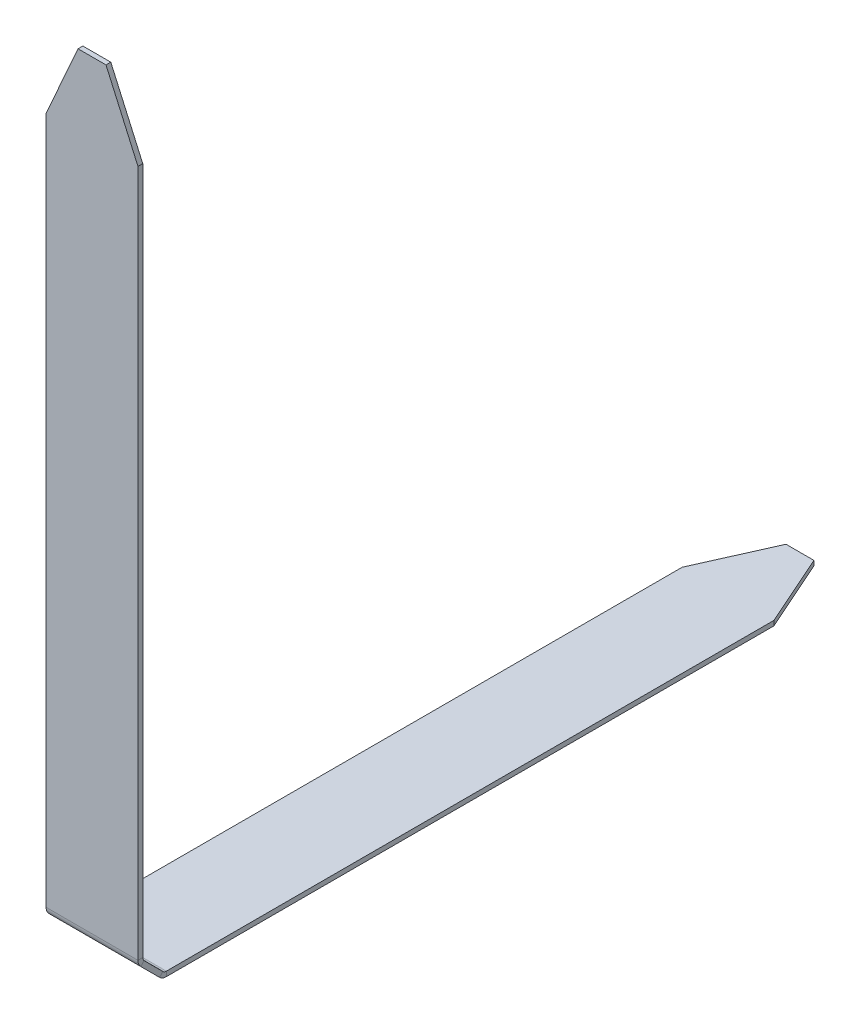
ISO-10303-21;
HEADER;
FILE_DESCRIPTION(('STEP AP214'),'2;1');
FILE_NAME('part.step','',(''),(''),'','','');
FILE_SCHEMA(('AUTOMOTIVE_DESIGN { 1 0 10303 214 1 1 1 1 }'));
ENDSEC;
DATA;
#1=APPLICATION_CONTEXT('core data for automotive mechanical design processes');
#2=APPLICATION_PROTOCOL_DEFINITION('international standard','automotive_design',2000,#1);
#3=PRODUCT_CONTEXT('',#1,'mechanical');
#4=PRODUCT('Part','Part','',(#3));
#5=PRODUCT_RELATED_PRODUCT_CATEGORY('part','',(#4));
#6=PRODUCT_DEFINITION_FORMATION('','',#4);
#7=PRODUCT_DEFINITION_CONTEXT('part definition',#1,'design');
#8=PRODUCT_DEFINITION('design','',#6,#7);
#9=PRODUCT_DEFINITION_SHAPE('','',#8);
#10=(LENGTH_UNIT() NAMED_UNIT(*) SI_UNIT(.MILLI.,.METRE.));
#11=(NAMED_UNIT(*) PLANE_ANGLE_UNIT() SI_UNIT($,.RADIAN.));
#12=(NAMED_UNIT(*) SI_UNIT($,.STERADIAN.) SOLID_ANGLE_UNIT());
#13=UNCERTAINTY_MEASURE_WITH_UNIT(LENGTH_MEASURE(1.E-05),#10,'distance_accuracy_value','');
#14=(GEOMETRIC_REPRESENTATION_CONTEXT(3) GLOBAL_UNCERTAINTY_ASSIGNED_CONTEXT((#13)) GLOBAL_UNIT_ASSIGNED_CONTEXT((#10,
#11,#12)) REPRESENTATION_CONTEXT('',''));
#15=CARTESIAN_POINT('',(0.,0.,0.));
#16=DIRECTION('',(0.,0.,1.));
#17=DIRECTION('',(1.,0.,0.));
#18=AXIS2_PLACEMENT_3D('',#15,#16,#17);
#19=CARTESIAN_POINT('',(115.,25.2426406871193,-1.75735931288074));
#20=DIRECTION('',(1.,0.,0.));
#21=DIRECTION('',(0.,0.,-1.));
#22=AXIS2_PLACEMENT_3D('',#19,#20,#21);
#23=PLANE('',#22);
#24=DIRECTION('',(0.,-0.707106781186548,0.707106781186548));
#25=VECTOR('',#24,1.);
#26=CARTESIAN_POINT('',(115.,25.2426406871193,-1.75735931288074));
#27=LINE('',#26,#25);
#28=CARTESIAN_POINT('',(115.,25.2426406871193,-1.75735931288074));
#29=VERTEX_POINT('',#28);
#30=CARTESIAN_POINT('',(115.,21.,2.48528137423854));
#31=VERTEX_POINT('',#30);
#32=EDGE_CURVE('E274',#29,#31,#27,.T.);
#33=ORIENTED_EDGE('',*,*,#32,.F.);
#34=CARTESIAN_POINT('',(115.,29.4852813742385,-6.00000000000003));
#35=DIRECTION('',(-1.,0.,0.));
#36=DIRECTION('',(0.,0.,1.));
#37=AXIS2_PLACEMENT_3D('',#34,#35,#36);
#38=CIRCLE('',#37,6.);
#39=CARTESIAN_POINT('',(115.,29.4852813742386,0.));
#40=VERTEX_POINT('',#39);
#41=EDGE_CURVE('E193',#40,#29,#38,.F.);
#42=ORIENTED_EDGE('',*,*,#41,.F.);
#43=DIRECTION('',(0.,0.,-1.));
#44=VECTOR('',#43,1.);
#45=CARTESIAN_POINT('',(115.,29.4852813742386,5.99999999999997));
#46=LINE('',#45,#44);
#47=CARTESIAN_POINT('',(115.,29.4852813742386,5.99999999999997));
#48=VERTEX_POINT('',#47);
#49=EDGE_CURVE('E271',#48,#40,#46,.T.);
#50=ORIENTED_EDGE('',*,*,#49,.F.);
#51=CARTESIAN_POINT('',(115.,29.4852813742385,-6.00000000000003));
#52=DIRECTION('',(1.,0.,0.));
#53=DIRECTION('',(0.,0.,-1.));
#54=AXIS2_PLACEMENT_3D('',#51,#52,#53);
#55=CIRCLE('',#54,12.);
#56=EDGE_CURVE('E203',#48,#31,#55,.T.);
#57=ORIENTED_EDGE('',*,*,#56,.T.);
#58=EDGE_LOOP('',(#33,#42,#50,#57));
#59=FACE_BOUND('',#58,.T.);
#60=ADVANCED_FACE('F38',(#59),#23,.T.);
#61=CARTESIAN_POINT('',(115.,29.4852813742386,5.99999999999997));
#62=DIRECTION('',(1.,0.,0.));
#63=DIRECTION('',(0.,0.,-1.));
#64=AXIS2_PLACEMENT_3D('',#61,#62,#63);
#65=PLANE('',#64);
#66=DIRECTION('',(0.,-0.707106781186548,-0.707106781186548));
#67=VECTOR('',#66,1.);
#68=CARTESIAN_POINT('',(115.,27.,0.));
#69=LINE('',#68,#67);
#70=CARTESIAN_POINT('',(115.,1.7573593128807,-25.2426406871193));
#71=VERTEX_POINT('',#70);
#72=EDGE_CURVE('E191',#29,#71,#69,.T.);
#73=ORIENTED_EDGE('',*,*,#72,.F.);
#74=ORIENTED_EDGE('',*,*,#32,.T.);
#75=DIRECTION('',(0.,-0.707106781186548,-0.707106781186548));
#76=VECTOR('',#75,1.);
#77=CARTESIAN_POINT('',(115.,22.7573593128807,4.24264068711929));
#78=LINE('',#77,#76);
#79=CARTESIAN_POINT('',(115.,-2.48528137423859,-21.));
#80=VERTEX_POINT('',#79);
#81=EDGE_CURVE('E206',#31,#80,#78,.T.);
#82=ORIENTED_EDGE('',*,*,#81,.T.);
#83=DIRECTION('',(0.,0.707106781186549,-0.707106781186546));
#84=VECTOR('',#83,1.);
#85=CARTESIAN_POINT('',(115.,-2.48528137423859,-21.));
#86=LINE('',#85,#84);
#87=EDGE_CURVE('E164',#80,#71,#86,.T.);
#88=ORIENTED_EDGE('',*,*,#87,.T.);
#89=EDGE_LOOP('',(#73,#74,#82,#88));
#90=FACE_BOUND('',#89,.T.);
#91=ADVANCED_FACE('F341',(#90),#65,.T.);
#92=CARTESIAN_POINT('',(0.,29.4852813742386,0.));
#93=DIRECTION('',(-1.,0.,0.));
#94=DIRECTION('',(0.,0.,1.));
#95=AXIS2_PLACEMENT_3D('',#92,#93,#94);
#96=PLANE('',#95);
#97=DIRECTION('',(0.,0.,1.));
#98=VECTOR('',#97,1.);
#99=CARTESIAN_POINT('',(0.,29.4852813742386,0.));
#100=LINE('',#99,#98);
#101=CARTESIAN_POINT('',(0.,29.4852813742386,0.));
#102=VERTEX_POINT('',#101);
#103=CARTESIAN_POINT('',(0.,29.4852813742386,5.99999999999997));
#104=VERTEX_POINT('',#103);
#105=EDGE_CURVE('E268',#102,#104,#100,.T.);
#106=ORIENTED_EDGE('',*,*,#105,.F.);
#107=CARTESIAN_POINT('',(0.,29.4852813742385,-6.00000000000003));
#108=DIRECTION('',(-1.,0.,0.));
#109=DIRECTION('',(0.,0.,1.));
#110=AXIS2_PLACEMENT_3D('',#107,#108,#109);
#111=CIRCLE('',#110,6.);
#112=CARTESIAN_POINT('',(0.,25.2426406871193,-1.75735931288074));
#113=VERTEX_POINT('',#112);
#114=EDGE_CURVE('E220',#102,#113,#111,.F.);
#115=ORIENTED_EDGE('',*,*,#114,.T.);
#116=DIRECTION('',(0.,0.707106781186548,-0.707106781186548));
#117=VECTOR('',#116,1.);
#118=CARTESIAN_POINT('',(0.,21.,2.48528137423854));
#119=LINE('',#118,#117);
#120=CARTESIAN_POINT('',(0.,21.,2.48528137423854));
#121=VERTEX_POINT('',#120);
#122=EDGE_CURVE('E163',#121,#113,#119,.T.);
#123=ORIENTED_EDGE('',*,*,#122,.F.);
#124=CARTESIAN_POINT('',(0.,29.4852813742385,-6.00000000000003));
#125=DIRECTION('',(1.,0.,0.));
#126=DIRECTION('',(0.,0.,-1.));
#127=AXIS2_PLACEMENT_3D('',#124,#125,#126);
#128=CIRCLE('',#127,12.);
#129=EDGE_CURVE('E227',#104,#121,#128,.T.);
#130=ORIENTED_EDGE('',*,*,#129,.F.);
#131=EDGE_LOOP('',(#106,#115,#123,#130));
#132=FACE_BOUND('',#131,.T.);
#133=ADVANCED_FACE('F322',(#132),#96,.T.);
#134=CARTESIAN_POINT('',(0.,21.,2.48528137423854));
#135=DIRECTION('',(-1.,0.,0.));
#136=DIRECTION('',(0.,0.,1.));
#137=AXIS2_PLACEMENT_3D('',#134,#135,#136);
#138=PLANE('',#137);
#139=DIRECTION('',(0.,-1.,0.));
#140=VECTOR('',#139,1.);
#141=CARTESIAN_POINT('',(0.,980.,6.00000000000001));
#142=LINE('',#141,#140);
#143=CARTESIAN_POINT('',(0.,889.999999999999,6.00000000000001));
#144=VERTEX_POINT('',#143);
#145=EDGE_CURVE('E225',#144,#104,#142,.T.);
#146=ORIENTED_EDGE('',*,*,#145,.F.);
#147=DIRECTION('',(0.,0.,-1.));
#148=VECTOR('',#147,1.);
#149=CARTESIAN_POINT('',(0.,889.999999999999,2.48528137423854));
#150=LINE('',#149,#148);
#151=CARTESIAN_POINT('',(0.,889.999999999999,0.));
#152=VERTEX_POINT('',#151);
#153=EDGE_CURVE('E302',#144,#152,#150,.T.);
#154=ORIENTED_EDGE('',*,*,#153,.T.);
#155=DIRECTION('',(0.,-1.,0.));
#156=VECTOR('',#155,1.);
#157=CARTESIAN_POINT('',(0.,980.,0.));
#158=LINE('',#157,#156);
#159=EDGE_CURVE('E223',#152,#102,#158,.T.);
#160=ORIENTED_EDGE('',*,*,#159,.T.);
#161=ORIENTED_EDGE('',*,*,#105,.T.);
#162=EDGE_LOOP('',(#146,#154,#160,#161));
#163=FACE_BOUND('',#162,.T.);
#164=ADVANCED_FACE('F308',(#163),#138,.T.);
#165=CARTESIAN_POINT('',(115.,0.,-29.4852813742386));
#166=DIRECTION('',(1.,0.,0.));
#167=DIRECTION('',(0.,0.,-1.));
#168=AXIS2_PLACEMENT_3D('',#165,#166,#167);
#169=PLANE('',#168);
#170=DIRECTION('',(0.,-1.,0.));
#171=VECTOR('',#170,1.);
#172=CARTESIAN_POINT('',(115.,0.,-29.4852813742386));
#173=LINE('',#172,#171);
#174=CARTESIAN_POINT('',(115.,0.,-29.4852813742386));
#175=VERTEX_POINT('',#174);
#176=CARTESIAN_POINT('',(115.,-6.,-29.4852813742386));
#177=VERTEX_POINT('',#176);
#178=EDGE_CURVE('E151',#175,#177,#173,.T.);
#179=ORIENTED_EDGE('',*,*,#178,.F.);
#180=CARTESIAN_POINT('',(115.,6.,-29.4852813742386));
#181=DIRECTION('',(-1.,0.,0.));
#182=DIRECTION('',(0.,0.,1.));
#183=AXIS2_PLACEMENT_3D('',#180,#181,#182);
#184=CIRCLE('',#183,6.);
#185=EDGE_CURVE('E155',#71,#175,#184,.F.);
#186=ORIENTED_EDGE('',*,*,#185,.F.);
#187=ORIENTED_EDGE('',*,*,#87,.F.);
#188=CARTESIAN_POINT('',(115.,6.,-29.4852813742386));
#189=DIRECTION('',(1.,0.,0.));
#190=DIRECTION('',(0.,0.,-1.));
#191=AXIS2_PLACEMENT_3D('',#188,#189,#190);
#192=CIRCLE('',#191,12.);
#193=EDGE_CURVE('E158',#80,#177,#192,.T.);
#194=ORIENTED_EDGE('',*,*,#193,.T.);
#195=EDGE_LOOP('',(#179,#186,#187,#194));
#196=FACE_BOUND('',#195,.T.);
#197=ADVANCED_FACE('F153',(#196),#169,.T.);
#198=CARTESIAN_POINT('',(115.,-2.48528137423859,-21.));
#199=DIRECTION('',(1.,0.,0.));
#200=DIRECTION('',(0.,0.,-1.));
#201=AXIS2_PLACEMENT_3D('',#198,#199,#200);
#202=PLANE('',#201);
#203=DIRECTION('',(0.,0.,-1.));
#204=VECTOR('',#203,1.);
#205=CARTESIAN_POINT('',(115.,-6.,-27.));
#206=LINE('',#205,#204);
#207=CARTESIAN_POINT('',(115.,-6.,-789.999999999999));
#208=VERTEX_POINT('',#207);
#209=EDGE_CURVE('E186',#177,#208,#206,.T.);
#210=ORIENTED_EDGE('',*,*,#209,.T.);
#211=DIRECTION('',(0.,1.,0.));
#212=VECTOR('',#211,1.);
#213=CARTESIAN_POINT('',(115.,-2.48528137423859,-789.999999999999));
#214=LINE('',#213,#212);
#215=CARTESIAN_POINT('',(115.,0.,-789.999999999999));
#216=VERTEX_POINT('',#215);
#217=EDGE_CURVE('E185',#208,#216,#214,.T.);
#218=ORIENTED_EDGE('',*,*,#217,.T.);
#219=DIRECTION('',(0.,0.,-1.));
#220=VECTOR('',#219,1.);
#221=CARTESIAN_POINT('',(115.,0.,-27.));
#222=LINE('',#221,#220);
#223=EDGE_CURVE('E173',#175,#216,#222,.T.);
#224=ORIENTED_EDGE('',*,*,#223,.F.);
#225=ORIENTED_EDGE('',*,*,#178,.T.);
#226=EDGE_LOOP('',(#210,#218,#224,#225));
#227=FACE_BOUND('',#226,.T.);
#228=ADVANCED_FACE('F183',(#227),#202,.T.);
#229=CARTESIAN_POINT('',(0.,1.7573593128807,-25.2426406871193));
#230=DIRECTION('',(-1.,0.,0.));
#231=DIRECTION('',(0.,0.,1.));
#232=AXIS2_PLACEMENT_3D('',#229,#230,#231);
#233=PLANE('',#232);
#234=DIRECTION('',(0.,-0.707106781186549,0.707106781186546));
#235=VECTOR('',#234,1.);
#236=CARTESIAN_POINT('',(0.,1.7573593128807,-25.2426406871193));
#237=LINE('',#236,#235);
#238=CARTESIAN_POINT('',(0.,1.7573593128807,-25.2426406871193));
#239=VERTEX_POINT('',#238);
#240=CARTESIAN_POINT('',(0.,-2.48528137423859,-21.));
#241=VERTEX_POINT('',#240);
#242=EDGE_CURVE('E264',#239,#241,#237,.T.);
#243=ORIENTED_EDGE('',*,*,#242,.F.);
#244=CARTESIAN_POINT('',(0.,6.,-29.4852813742386));
#245=DIRECTION('',(-1.,0.,0.));
#246=DIRECTION('',(0.,0.,1.));
#247=AXIS2_PLACEMENT_3D('',#244,#245,#246);
#248=CIRCLE('',#247,6.);
#249=CARTESIAN_POINT('',(0.,0.,-29.4852813742386));
#250=VERTEX_POINT('',#249);
#251=EDGE_CURVE('E215',#239,#250,#248,.F.);
#252=ORIENTED_EDGE('',*,*,#251,.T.);
#253=DIRECTION('',(0.,1.,0.));
#254=VECTOR('',#253,1.);
#255=CARTESIAN_POINT('',(0.,-6.,-29.4852813742386));
#256=LINE('',#255,#254);
#257=CARTESIAN_POINT('',(0.,-6.,-29.4852813742386));
#258=VERTEX_POINT('',#257);
#259=EDGE_CURVE('E262',#258,#250,#256,.T.);
#260=ORIENTED_EDGE('',*,*,#259,.F.);
#261=CARTESIAN_POINT('',(0.,6.,-29.4852813742386));
#262=DIRECTION('',(1.,0.,0.));
#263=DIRECTION('',(0.,0.,-1.));
#264=AXIS2_PLACEMENT_3D('',#261,#262,#263);
#265=CIRCLE('',#264,12.);
#266=EDGE_CURVE('E233',#241,#258,#265,.T.);
#267=ORIENTED_EDGE('',*,*,#266,.F.);
#268=EDGE_LOOP('',(#243,#252,#260,#267));
#269=FACE_BOUND('',#268,.T.);
#270=ADVANCED_FACE('F391',(#269),#233,.T.);
#271=CARTESIAN_POINT('',(0.,-6.,-29.4852813742386));
#272=DIRECTION('',(-1.,0.,0.));
#273=DIRECTION('',(0.,0.,1.));
#274=AXIS2_PLACEMENT_3D('',#271,#272,#273);
#275=PLANE('',#274);
#276=DIRECTION('',(0.,-0.707106781186548,-0.707106781186548));
#277=VECTOR('',#276,1.);
#278=CARTESIAN_POINT('',(0.,27.,0.));
#279=LINE('',#278,#277);
#280=EDGE_CURVE('E217',#113,#239,#279,.T.);
#281=ORIENTED_EDGE('',*,*,#280,.T.);
#282=ORIENTED_EDGE('',*,*,#242,.T.);
#283=DIRECTION('',(0.,-0.707106781186548,-0.707106781186548));
#284=VECTOR('',#283,1.);
#285=CARTESIAN_POINT('',(0.,22.7573593128807,4.24264068711929));
#286=LINE('',#285,#284);
#287=EDGE_CURVE('E230',#121,#241,#286,.T.);
#288=ORIENTED_EDGE('',*,*,#287,.F.);
#289=ORIENTED_EDGE('',*,*,#122,.T.);
#290=EDGE_LOOP('',(#281,#282,#288,#289));
#291=FACE_BOUND('',#290,.T.);
#292=ADVANCED_FACE('F393',(#291),#275,.T.);
#293=CARTESIAN_POINT('',(115.,-6.,-27.));
#294=DIRECTION('',(0.,1.,0.));
#295=DIRECTION('',(0.,0.,1.));
#296=AXIS2_PLACEMENT_3D('',#293,#294,#295);
#297=PLANE('',#296);
#298=DIRECTION('',(0.,0.,-1.));
#299=VECTOR('',#298,1.);
#300=CARTESIAN_POINT('',(0.,-6.,-27.));
#301=LINE('',#300,#299);
#302=CARTESIAN_POINT('',(0.,-6.,-789.999999999999));
#303=VERTEX_POINT('',#302);
#304=EDGE_CURVE('E211',#258,#303,#301,.T.);
#305=ORIENTED_EDGE('',*,*,#304,.T.);
#306=DIRECTION('',(-0.406138466053445,0.,0.913811548620258));
#307=VECTOR('',#306,1.);
#308=CARTESIAN_POINT('',(0.,-6.,-789.999999999999));
#309=LINE('',#308,#307);
#310=CARTESIAN_POINT('',(40.,-6.,-880.));
#311=VERTEX_POINT('',#310);
#312=EDGE_CURVE('E296',#303,#311,#309,.F.);
#313=ORIENTED_EDGE('',*,*,#312,.T.);
#314=DIRECTION('',(-1.,0.,0.));
#315=VECTOR('',#314,1.);
#316=CARTESIAN_POINT('',(115.,-6.,-880.));
#317=LINE('',#316,#315);
#318=CARTESIAN_POINT('',(74.9999999999999,-6.,-880.));
#319=VERTEX_POINT('',#318);
#320=EDGE_CURVE('E259',#319,#311,#317,.T.);
#321=ORIENTED_EDGE('',*,*,#320,.F.);
#322=DIRECTION('',(-0.406138466053446,0.,-0.913811548620258));
#323=VECTOR('',#322,1.);
#324=CARTESIAN_POINT('',(74.9999999999999,-6.,-880.));
#325=LINE('',#324,#323);
#326=EDGE_CURVE('E279',#319,#208,#325,.F.);
#327=ORIENTED_EDGE('',*,*,#326,.T.);
#328=ORIENTED_EDGE('',*,*,#209,.F.);
#329=DIRECTION('',(-1.,0.,0.));
#330=VECTOR('',#329,1.);
#331=CARTESIAN_POINT('',(115.,-6.,-29.4852813742386));
#332=LINE('',#331,#330);
#333=EDGE_CURVE('E210',#177,#258,#332,.T.);
#334=ORIENTED_EDGE('',*,*,#333,.T.);
#335=EDGE_LOOP('',(#305,#313,#321,#327,#328,#334));
#336=FACE_BOUND('',#335,.T.);
#337=ADVANCED_FACE('F380',(#336),#297,.F.);
#338=CARTESIAN_POINT('',(115.,0.,-880.));
#339=DIRECTION('',(0.,0.,-1.));
#340=DIRECTION('',(-1.,0.,0.));
#341=AXIS2_PLACEMENT_3D('',#338,#339,#340);
#342=PLANE('',#341);
#343=ORIENTED_EDGE('',*,*,#320,.T.);
#344=DIRECTION('',(0.,1.,0.));
#345=VECTOR('',#344,1.);
#346=CARTESIAN_POINT('',(40.,0.,-880.));
#347=LINE('',#346,#345);
#348=CARTESIAN_POINT('',(40.,0.,-880.));
#349=VERTEX_POINT('',#348);
#350=EDGE_CURVE('E298',#311,#349,#347,.T.);
#351=ORIENTED_EDGE('',*,*,#350,.T.);
#352=DIRECTION('',(-1.,0.,0.));
#353=VECTOR('',#352,1.);
#354=CARTESIAN_POINT('',(115.,0.,-880.));
#355=LINE('',#354,#353);
#356=CARTESIAN_POINT('',(74.9999999999999,0.,-880.));
#357=VERTEX_POINT('',#356);
#358=EDGE_CURVE('E180',#357,#349,#355,.T.);
#359=ORIENTED_EDGE('',*,*,#358,.F.);
#360=DIRECTION('',(0.,-1.,0.));
#361=VECTOR('',#360,1.);
#362=CARTESIAN_POINT('',(74.9999999999999,0.,-880.));
#363=LINE('',#362,#361);
#364=EDGE_CURVE('E276',#357,#319,#363,.T.);
#365=ORIENTED_EDGE('',*,*,#364,.T.);
#366=EDGE_LOOP('',(#343,#351,#359,#365));
#367=FACE_BOUND('',#366,.T.);
#368=ADVANCED_FACE('F386',(#367),#342,.T.);
#369=CARTESIAN_POINT('',(115.,0.,-27.));
#370=DIRECTION('',(0.,1.,0.));
#371=DIRECTION('',(0.,0.,1.));
#372=AXIS2_PLACEMENT_3D('',#369,#370,#371);
#373=PLANE('',#372);
#374=ORIENTED_EDGE('',*,*,#358,.T.);
#375=DIRECTION('',(0.406138466053445,0.,-0.913811548620258));
#376=VECTOR('',#375,1.);
#377=CARTESIAN_POINT('',(-264.206185567009,0.,-195.536082474225));
#378=LINE('',#377,#376);
#379=CARTESIAN_POINT('',(0.,0.,-789.999999999999));
#380=VERTEX_POINT('',#379);
#381=EDGE_CURVE('E300',#349,#380,#378,.F.);
#382=ORIENTED_EDGE('',*,*,#381,.T.);
#383=DIRECTION('',(0.,0.,-1.));
#384=VECTOR('',#383,1.);
#385=CARTESIAN_POINT('',(0.,0.,-27.));
#386=LINE('',#385,#384);
#387=EDGE_CURVE('E176',#250,#380,#386,.T.);
#388=ORIENTED_EDGE('',*,*,#387,.F.);
#389=DIRECTION('',(-1.,0.,0.));
#390=VECTOR('',#389,1.);
#391=CARTESIAN_POINT('',(115.,0.,-29.4852813742386));
#392=LINE('',#391,#390);
#393=EDGE_CURVE('E170',#175,#250,#392,.T.);
#394=ORIENTED_EDGE('',*,*,#393,.F.);
#395=ORIENTED_EDGE('',*,*,#223,.T.);
#396=DIRECTION('',(0.406138466053446,0.,0.913811548620258));
#397=VECTOR('',#396,1.);
#398=CARTESIAN_POINT('',(398.175257731958,0.,-152.855670103092));
#399=LINE('',#398,#397);
#400=EDGE_CURVE('E282',#216,#357,#399,.F.);
#401=ORIENTED_EDGE('',*,*,#400,.T.);
#402=EDGE_LOOP('',(#374,#382,#388,#394,#395,#401));
#403=FACE_BOUND('',#402,.T.);
#404=ADVANCED_FACE('F172',(#403),#373,.T.);
#405=CARTESIAN_POINT('',(115.,6.,-29.4852813742386));
#406=DIRECTION('',(-1.,0.,0.));
#407=DIRECTION('',(0.,0.,1.));
#408=AXIS2_PLACEMENT_3D('',#405,#406,#407);
#409=CYLINDRICAL_SURFACE('',#408,6.);
#410=ORIENTED_EDGE('',*,*,#251,.F.);
#411=DIRECTION('',(-1.,0.,0.));
#412=VECTOR('',#411,1.);
#413=CARTESIAN_POINT('',(115.,1.7573593128807,-25.2426406871193));
#414=LINE('',#413,#412);
#415=EDGE_CURVE('E181',#71,#239,#414,.T.);
#416=ORIENTED_EDGE('',*,*,#415,.F.);
#417=ORIENTED_EDGE('',*,*,#185,.T.);
#418=ORIENTED_EDGE('',*,*,#393,.T.);
#419=EDGE_LOOP('',(#410,#416,#417,#418));
#420=FACE_BOUND('',#419,.T.);
#421=ADVANCED_FACE('F189',(#420),#409,.F.);
#422=CARTESIAN_POINT('',(115.,27.,0.));
#423=DIRECTION('',(0.,0.707106781186547,-0.707106781186547));
#424=DIRECTION('',(0.,0.707106781186548,0.707106781186548));
#425=AXIS2_PLACEMENT_3D('',#422,#423,#424);
#426=PLANE('',#425);
#427=ORIENTED_EDGE('',*,*,#280,.F.);
#428=DIRECTION('',(-1.,0.,0.));
#429=VECTOR('',#428,1.);
#430=CARTESIAN_POINT('',(115.,25.2426406871193,-1.75735931288074));
#431=LINE('',#430,#429);
#432=EDGE_CURVE('E254',#29,#113,#431,.T.);
#433=ORIENTED_EDGE('',*,*,#432,.F.);
#434=ORIENTED_EDGE('',*,*,#72,.T.);
#435=ORIENTED_EDGE('',*,*,#415,.T.);
#436=EDGE_LOOP('',(#427,#433,#434,#435));
#437=FACE_BOUND('',#436,.T.);
#438=ADVANCED_FACE('F368',(#437),#426,.T.);
#439=CARTESIAN_POINT('',(115.,29.4852813742385,-6.00000000000003));
#440=DIRECTION('',(-1.,0.,0.));
#441=DIRECTION('',(0.,0.,1.));
#442=AXIS2_PLACEMENT_3D('',#439,#440,#441);
#443=CYLINDRICAL_SURFACE('',#442,6.);
#444=ORIENTED_EDGE('',*,*,#114,.F.);
#445=DIRECTION('',(-1.,0.,0.));
#446=VECTOR('',#445,1.);
#447=CARTESIAN_POINT('',(115.,29.4852813742386,0.));
#448=LINE('',#447,#446);
#449=EDGE_CURVE('E251',#40,#102,#448,.T.);
#450=ORIENTED_EDGE('',*,*,#449,.F.);
#451=ORIENTED_EDGE('',*,*,#41,.T.);
#452=ORIENTED_EDGE('',*,*,#432,.T.);
#453=EDGE_LOOP('',(#444,#450,#451,#452));
#454=FACE_BOUND('',#453,.T.);
#455=ADVANCED_FACE('F318',(#454),#443,.F.);
#456=CARTESIAN_POINT('',(115.,980.,0.));
#457=DIRECTION('',(0.,0.,-1.));
#458=DIRECTION('',(0.,1.,0.));
#459=AXIS2_PLACEMENT_3D('',#456,#457,#458);
#460=PLANE('',#459);
#461=ORIENTED_EDGE('',*,*,#159,.F.);
#462=DIRECTION('',(-0.406138466053445,-0.913811548620258,0.));
#463=VECTOR('',#462,1.);
#464=CARTESIAN_POINT('',(52.3711340206184,1007.83505154639,0.));
#465=LINE('',#464,#463);
#466=CARTESIAN_POINT('',(40.,980.,0.));
#467=VERTEX_POINT('',#466);
#468=EDGE_CURVE('E60',#152,#467,#465,.F.);
#469=ORIENTED_EDGE('',*,*,#468,.T.);
#470=DIRECTION('',(-1.,0.,0.));
#471=VECTOR('',#470,1.);
#472=CARTESIAN_POINT('',(115.,980.,0.));
#473=LINE('',#472,#471);
#474=CARTESIAN_POINT('',(74.9999999999999,980.,0.));
#475=VERTEX_POINT('',#474);
#476=EDGE_CURVE('E249',#475,#467,#473,.T.);
#477=ORIENTED_EDGE('',*,*,#476,.F.);
#478=DIRECTION('',(0.406138466053446,-0.913811548620258,0.));
#479=VECTOR('',#478,1.);
#480=CARTESIAN_POINT('',(81.5979381443297,965.154639175258,0.));
#481=LINE('',#480,#479);
#482=CARTESIAN_POINT('',(115.,889.999999999999,0.));
#483=VERTEX_POINT('',#482);
#484=EDGE_CURVE('E287',#475,#483,#481,.T.);
#485=ORIENTED_EDGE('',*,*,#484,.T.);
#486=DIRECTION('',(0.,-1.,0.));
#487=VECTOR('',#486,1.);
#488=CARTESIAN_POINT('',(115.,980.,0.));
#489=LINE('',#488,#487);
#490=EDGE_CURVE('E199',#483,#40,#489,.T.);
#491=ORIENTED_EDGE('',*,*,#490,.T.);
#492=ORIENTED_EDGE('',*,*,#449,.T.);
#493=EDGE_LOOP('',(#461,#469,#477,#485,#491,#492));
#494=FACE_BOUND('',#493,.T.);
#495=ADVANCED_FACE('F312',(#494),#460,.T.);
#496=CARTESIAN_POINT('',(115.,980.,6.00000000000001));
#497=DIRECTION('',(0.,1.,0.));
#498=DIRECTION('',(0.,0.,1.));
#499=AXIS2_PLACEMENT_3D('',#496,#497,#498);
#500=PLANE('',#499);
#501=ORIENTED_EDGE('',*,*,#476,.T.);
#502=DIRECTION('',(0.,0.,1.));
#503=VECTOR('',#502,1.);
#504=CARTESIAN_POINT('',(40.,980.,6.00000000000001));
#505=LINE('',#504,#503);
#506=CARTESIAN_POINT('',(40.,980.,6.00000000000001));
#507=VERTEX_POINT('',#506);
#508=EDGE_CURVE('E46',#467,#507,#505,.T.);
#509=ORIENTED_EDGE('',*,*,#508,.T.);
#510=DIRECTION('',(-1.,0.,0.));
#511=VECTOR('',#510,1.);
#512=CARTESIAN_POINT('',(115.,980.,6.00000000000001));
#513=LINE('',#512,#511);
#514=CARTESIAN_POINT('',(74.9999999999999,980.,6.00000000000001));
#515=VERTEX_POINT('',#514);
#516=EDGE_CURVE('E247',#515,#507,#513,.T.);
#517=ORIENTED_EDGE('',*,*,#516,.F.);
#518=DIRECTION('',(0.,0.,-1.));
#519=VECTOR('',#518,1.);
#520=CARTESIAN_POINT('',(74.9999999999999,980.,0.));
#521=LINE('',#520,#519);
#522=EDGE_CURVE('E284',#515,#475,#521,.T.);
#523=ORIENTED_EDGE('',*,*,#522,.T.);
#524=EDGE_LOOP('',(#501,#509,#517,#523));
#525=FACE_BOUND('',#524,.T.);
#526=ADVANCED_FACE('F362',(#525),#500,.T.);
#527=CARTESIAN_POINT('',(115.,980.,6.00000000000001));
#528=DIRECTION('',(0.,0.,-1.));
#529=DIRECTION('',(0.,1.,0.));
#530=AXIS2_PLACEMENT_3D('',#527,#528,#529);
#531=PLANE('',#530);
#532=ORIENTED_EDGE('',*,*,#516,.T.);
#533=DIRECTION('',(0.406138466053445,0.913811548620258,0.));
#534=VECTOR('',#533,1.);
#535=CARTESIAN_POINT('',(0.,889.999999999999,6.00000000000001));
#536=LINE('',#535,#534);
#537=EDGE_CURVE('E11',#507,#144,#536,.F.);
#538=ORIENTED_EDGE('',*,*,#537,.T.);
#539=ORIENTED_EDGE('',*,*,#145,.T.);
#540=DIRECTION('',(-1.,0.,0.));
#541=VECTOR('',#540,1.);
#542=CARTESIAN_POINT('',(115.,29.4852813742386,5.99999999999997));
#543=LINE('',#542,#541);
#544=EDGE_CURVE('E244',#48,#104,#543,.T.);
#545=ORIENTED_EDGE('',*,*,#544,.F.);
#546=DIRECTION('',(0.,-1.,0.));
#547=VECTOR('',#546,1.);
#548=CARTESIAN_POINT('',(115.,980.,6.00000000000001));
#549=LINE('',#548,#547);
#550=CARTESIAN_POINT('',(115.,889.999999999999,6.00000000000001));
#551=VERTEX_POINT('',#550);
#552=EDGE_CURVE('E201',#551,#48,#549,.T.);
#553=ORIENTED_EDGE('',*,*,#552,.F.);
#554=DIRECTION('',(-0.406138466053446,0.913811548620258,0.));
#555=VECTOR('',#554,1.);
#556=CARTESIAN_POINT('',(74.9999999999999,980.,6.00000000000001));
#557=LINE('',#556,#555);
#558=EDGE_CURVE('E291',#551,#515,#557,.T.);
#559=ORIENTED_EDGE('',*,*,#558,.T.);
#560=EDGE_LOOP('',(#532,#538,#539,#545,#553,#559));
#561=FACE_BOUND('',#560,.T.);
#562=ADVANCED_FACE('F331',(#561),#531,.F.);
#563=CARTESIAN_POINT('',(115.,29.4852813742385,-6.00000000000003));
#564=DIRECTION('',(-1.,0.,0.));
#565=DIRECTION('',(0.,0.,1.));
#566=AXIS2_PLACEMENT_3D('',#563,#564,#565);
#567=CYLINDRICAL_SURFACE('',#566,12.);
#568=ORIENTED_EDGE('',*,*,#129,.T.);
#569=DIRECTION('',(-1.,0.,0.));
#570=VECTOR('',#569,1.);
#571=CARTESIAN_POINT('',(115.,21.,2.48528137423854));
#572=LINE('',#571,#570);
#573=EDGE_CURVE('E241',#31,#121,#572,.T.);
#574=ORIENTED_EDGE('',*,*,#573,.F.);
#575=ORIENTED_EDGE('',*,*,#56,.F.);
#576=ORIENTED_EDGE('',*,*,#544,.T.);
#577=EDGE_LOOP('',(#568,#574,#575,#576));
#578=FACE_BOUND('',#577,.T.);
#579=ADVANCED_FACE('F327',(#578),#567,.T.);
#580=CARTESIAN_POINT('',(115.,22.7573593128807,4.24264068711929));
#581=DIRECTION('',(0.,0.707106781186547,-0.707106781186547));
#582=DIRECTION('',(0.,0.707106781186548,0.707106781186548));
#583=AXIS2_PLACEMENT_3D('',#580,#581,#582);
#584=PLANE('',#583);
#585=ORIENTED_EDGE('',*,*,#287,.T.);
#586=DIRECTION('',(-1.,0.,0.));
#587=VECTOR('',#586,1.);
#588=CARTESIAN_POINT('',(115.,-2.48528137423859,-21.));
#589=LINE('',#588,#587);
#590=EDGE_CURVE('E238',#80,#241,#589,.T.);
#591=ORIENTED_EDGE('',*,*,#590,.F.);
#592=ORIENTED_EDGE('',*,*,#81,.F.);
#593=ORIENTED_EDGE('',*,*,#573,.T.);
#594=EDGE_LOOP('',(#585,#591,#592,#593));
#595=FACE_BOUND('',#594,.T.);
#596=ADVANCED_FACE('F372',(#595),#584,.F.);
#597=CARTESIAN_POINT('',(115.,6.,-29.4852813742386));
#598=DIRECTION('',(-1.,0.,0.));
#599=DIRECTION('',(0.,0.,1.));
#600=AXIS2_PLACEMENT_3D('',#597,#598,#599);
#601=CYLINDRICAL_SURFACE('',#600,12.);
#602=ORIENTED_EDGE('',*,*,#266,.T.);
#603=ORIENTED_EDGE('',*,*,#333,.F.);
#604=ORIENTED_EDGE('',*,*,#193,.F.);
#605=ORIENTED_EDGE('',*,*,#590,.T.);
#606=EDGE_LOOP('',(#602,#603,#604,#605));
#607=FACE_BOUND('',#606,.T.);
#608=ADVANCED_FACE('F376',(#607),#601,.T.);
#609=CARTESIAN_POINT('',(115.,6.,-29.4852813742386));
#610=DIRECTION('',(-1.,0.,0.));
#611=DIRECTION('',(0.,0.,1.));
#612=AXIS2_PLACEMENT_3D('',#609,#610,#611);
#613=PLANE('',#612);
#614=ORIENTED_EDGE('',*,*,#490,.F.);
#615=DIRECTION('',(0.,0.,1.));
#616=VECTOR('',#615,1.);
#617=CARTESIAN_POINT('',(115.,889.999999999999,6.00000000000001));
#618=LINE('',#617,#616);
#619=EDGE_CURVE('E289',#483,#551,#618,.T.);
#620=ORIENTED_EDGE('',*,*,#619,.T.);
#621=ORIENTED_EDGE('',*,*,#552,.T.);
#622=ORIENTED_EDGE('',*,*,#49,.T.);
#623=EDGE_LOOP('',(#614,#620,#621,#622));
#624=FACE_BOUND('',#623,.T.);
#625=ADVANCED_FACE('F364',(#624),#613,.F.);
#626=CARTESIAN_POINT('',(0.,6.,-29.4852813742386));
#627=DIRECTION('',(-1.,0.,0.));
#628=DIRECTION('',(0.,0.,1.));
#629=AXIS2_PLACEMENT_3D('',#626,#627,#628);
#630=PLANE('',#629);
#631=ORIENTED_EDGE('',*,*,#387,.T.);
#632=DIRECTION('',(0.,-1.,0.));
#633=VECTOR('',#632,1.);
#634=CARTESIAN_POINT('',(0.,6.,-789.999999999999));
#635=LINE('',#634,#633);
#636=EDGE_CURVE('E293',#380,#303,#635,.T.);
#637=ORIENTED_EDGE('',*,*,#636,.T.);
#638=ORIENTED_EDGE('',*,*,#304,.F.);
#639=ORIENTED_EDGE('',*,*,#259,.T.);
#640=EDGE_LOOP('',(#631,#637,#638,#639));
#641=FACE_BOUND('',#640,.T.);
#642=ADVANCED_FACE('F354',(#641),#630,.T.);
#643=CARTESIAN_POINT('',(74.9999999999999,0.,-880.));
#644=DIRECTION('',(-0.913811548620258,0.,0.406138466053446));
#645=DIRECTION('',(0.,-1.,0.));
#646=AXIS2_PLACEMENT_3D('',#643,#644,#645);
#647=PLANE('',#646);
#648=ORIENTED_EDGE('',*,*,#400,.F.);
#649=ORIENTED_EDGE('',*,*,#217,.F.);
#650=ORIENTED_EDGE('',*,*,#326,.F.);
#651=ORIENTED_EDGE('',*,*,#364,.F.);
#652=EDGE_LOOP('',(#648,#649,#650,#651));
#653=FACE_BOUND('',#652,.T.);
#654=ADVANCED_FACE('F351',(#653),#647,.F.);
#655=CARTESIAN_POINT('',(74.9999999999999,980.,6.00000000000001));
#656=DIRECTION('',(0.913811548620258,0.406138466053446,0.));
#657=DIRECTION('',(0.,0.,1.));
#658=AXIS2_PLACEMENT_3D('',#655,#656,#657);
#659=PLANE('',#658);
#660=ORIENTED_EDGE('',*,*,#558,.F.);
#661=ORIENTED_EDGE('',*,*,#619,.F.);
#662=ORIENTED_EDGE('',*,*,#484,.F.);
#663=ORIENTED_EDGE('',*,*,#522,.F.);
#664=EDGE_LOOP('',(#660,#661,#662,#663));
#665=FACE_BOUND('',#664,.T.);
#666=ADVANCED_FACE('F338',(#665),#659,.T.);
#667=CARTESIAN_POINT('',(0.,6.,-789.999999999999));
#668=DIRECTION('',(0.913811548620258,0.,0.406138466053445));
#669=DIRECTION('',(0.,-1.,0.));
#670=AXIS2_PLACEMENT_3D('',#667,#668,#669);
#671=PLANE('',#670);
#672=ORIENTED_EDGE('',*,*,#381,.F.);
#673=ORIENTED_EDGE('',*,*,#350,.F.);
#674=ORIENTED_EDGE('',*,*,#312,.F.);
#675=ORIENTED_EDGE('',*,*,#636,.F.);
#676=EDGE_LOOP('',(#672,#673,#674,#675));
#677=FACE_BOUND('',#676,.T.);
#678=ADVANCED_FACE('F334',(#677),#671,.F.);
#679=CARTESIAN_POINT('',(0.,889.999999999999,2.48528137423854));
#680=DIRECTION('',(0.913811548620258,-0.406138466053445,0.));
#681=DIRECTION('',(0.,0.,-1.));
#682=AXIS2_PLACEMENT_3D('',#679,#680,#681);
#683=PLANE('',#682);
#684=ORIENTED_EDGE('',*,*,#537,.F.);
#685=ORIENTED_EDGE('',*,*,#508,.F.);
#686=ORIENTED_EDGE('',*,*,#468,.F.);
#687=ORIENTED_EDGE('',*,*,#153,.F.);
#688=EDGE_LOOP('',(#684,#685,#686,#687));
#689=FACE_BOUND('',#688,.T.);
#690=ADVANCED_FACE('F40',(#689),#683,.F.);
#691=CLOSED_SHELL('',(#60,#91,#133,#164,#197,#228,#270,#292,#337,#368,#404,#421,#438,#455,#495,
#526,#562,#579,#596,#608,#625,#642,#654,#666,#678,#690));
#692=MANIFOLD_SOLID_BREP('B2',#691);
#693=ADVANCED_BREP_SHAPE_REPRESENTATION('',(#18,#692),#14);
#694=SHAPE_DEFINITION_REPRESENTATION(#9,#693);
ENDSEC;
END-ISO-10303-21;
